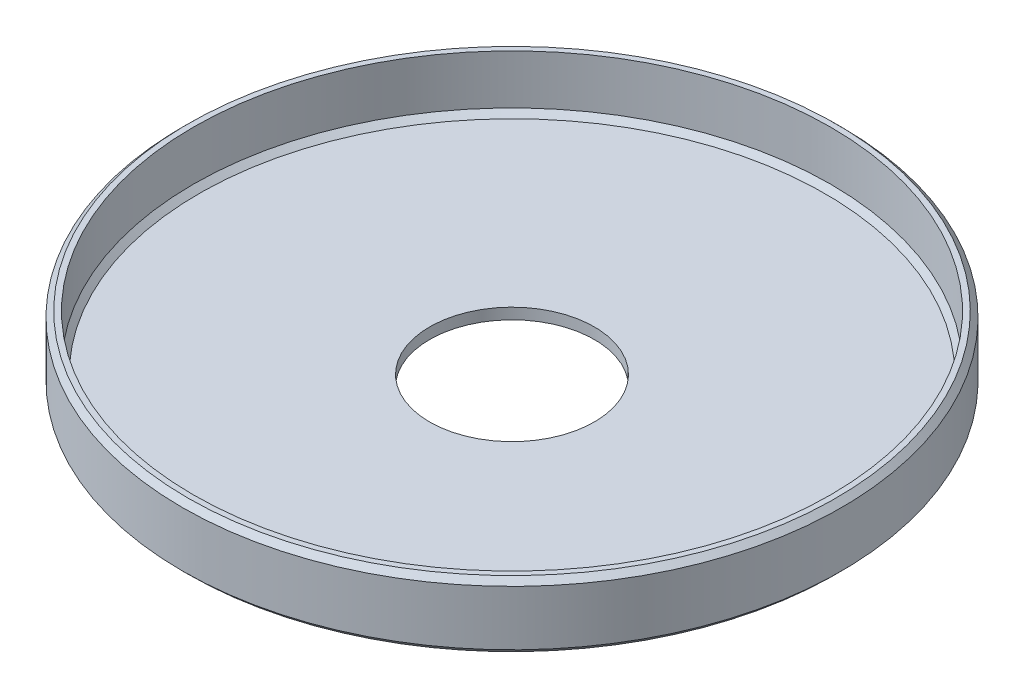
ISO-10303-21;
HEADER;
FILE_DESCRIPTION(('STEP AP214'),'2;1');
FILE_NAME('part.step','',(''),(''),'','','');
FILE_SCHEMA(('AUTOMOTIVE_DESIGN { 1 0 10303 214 1 1 1 1 }'));
ENDSEC;
DATA;
#1=APPLICATION_CONTEXT('core data for automotive mechanical design processes');
#2=APPLICATION_PROTOCOL_DEFINITION('international standard','automotive_design',2000,#1);
#3=PRODUCT_CONTEXT('',#1,'mechanical');
#4=PRODUCT('Part','Part','',(#3));
#5=PRODUCT_RELATED_PRODUCT_CATEGORY('part','',(#4));
#6=PRODUCT_DEFINITION_FORMATION('','',#4);
#7=PRODUCT_DEFINITION_CONTEXT('part definition',#1,'design');
#8=PRODUCT_DEFINITION('design','',#6,#7);
#9=PRODUCT_DEFINITION_SHAPE('','',#8);
#10=(LENGTH_UNIT() NAMED_UNIT(*) SI_UNIT(.MILLI.,.METRE.));
#11=(NAMED_UNIT(*) PLANE_ANGLE_UNIT() SI_UNIT($,.RADIAN.));
#12=(NAMED_UNIT(*) SI_UNIT($,.STERADIAN.) SOLID_ANGLE_UNIT());
#13=UNCERTAINTY_MEASURE_WITH_UNIT(LENGTH_MEASURE(1.E-05),#10,'distance_accuracy_value','');
#14=(GEOMETRIC_REPRESENTATION_CONTEXT(3) GLOBAL_UNCERTAINTY_ASSIGNED_CONTEXT((#13)) GLOBAL_UNIT_ASSIGNED_CONTEXT((#10,
#11,#12)) REPRESENTATION_CONTEXT('',''));
#15=CARTESIAN_POINT('',(0.,0.,0.));
#16=DIRECTION('',(0.,0.,1.));
#17=DIRECTION('',(1.,0.,0.));
#18=AXIS2_PLACEMENT_3D('',#15,#16,#17);
#19=CARTESIAN_POINT('',(0.,2.,0.));
#20=DIRECTION('',(0.,1.,0.));
#21=DIRECTION('',(0.,0.,1.));
#22=AXIS2_PLACEMENT_3D('',#19,#20,#21);
#23=PLANE('',#22);
#24=CARTESIAN_POINT('',(0.,2.,0.));
#25=DIRECTION('',(0.,1.,0.));
#26=DIRECTION('',(0.,0.,1.));
#27=AXIS2_PLACEMENT_3D('',#24,#25,#26);
#28=CIRCLE('',#27,57.);
#29=CARTESIAN_POINT('',(0.,2.,57.));
#30=VERTEX_POINT('',#29);
#31=EDGE_CURVE('E56',#30,#30,#28,.T.);
#32=ORIENTED_EDGE('',*,*,#31,.T.);
#33=EDGE_LOOP('',(#32));
#34=FACE_BOUND('',#33,.T.);
#35=CARTESIAN_POINT('',(0.,2.,0.));
#36=DIRECTION('',(0.,1.,0.));
#37=DIRECTION('',(0.,0.,1.));
#38=AXIS2_PLACEMENT_3D('',#35,#36,#37);
#39=CIRCLE('',#38,15.);
#40=CARTESIAN_POINT('',(0.,2.,15.));
#41=VERTEX_POINT('',#40);
#42=EDGE_CURVE('E62',#41,#41,#39,.T.);
#43=ORIENTED_EDGE('',*,*,#42,.F.);
#44=EDGE_LOOP('',(#43));
#45=FACE_BOUND('',#44,.T.);
#46=ADVANCED_FACE('F35',(#34,#45),#23,.T.);
#47=CARTESIAN_POINT('',(0.,0.,0.));
#48=DIRECTION('',(0.,1.,0.));
#49=DIRECTION('',(0.,0.,1.));
#50=AXIS2_PLACEMENT_3D('',#47,#48,#49);
#51=PLANE('',#50);
#52=CARTESIAN_POINT('',(0.,0.,0.));
#53=DIRECTION('',(0.,1.,0.));
#54=DIRECTION('',(0.,0.,1.));
#55=AXIS2_PLACEMENT_3D('',#52,#53,#54);
#56=CIRCLE('',#55,59.);
#57=CARTESIAN_POINT('',(0.,0.,59.));
#58=VERTEX_POINT('',#57);
#59=EDGE_CURVE('E47',#58,#58,#56,.F.);
#60=ORIENTED_EDGE('',*,*,#59,.T.);
#61=EDGE_LOOP('',(#60));
#62=FACE_BOUND('',#61,.T.);
#63=CARTESIAN_POINT('',(0.,0.,0.));
#64=DIRECTION('',(0.,1.,0.));
#65=DIRECTION('',(0.,0.,1.));
#66=AXIS2_PLACEMENT_3D('',#63,#64,#65);
#67=CIRCLE('',#66,15.);
#68=CARTESIAN_POINT('',(0.,0.,15.));
#69=VERTEX_POINT('',#68);
#70=EDGE_CURVE('E63',#69,#69,#67,.T.);
#71=ORIENTED_EDGE('',*,*,#70,.T.);
#72=EDGE_LOOP('',(#71));
#73=FACE_BOUND('',#72,.T.);
#74=ADVANCED_FACE('F89',(#62,#73),#51,.F.);
#75=CARTESIAN_POINT('',(0.,2.,0.));
#76=DIRECTION('',(0.,-1.,0.));
#77=DIRECTION('',(0.,0.,-1.));
#78=AXIS2_PLACEMENT_3D('',#75,#76,#77);
#79=CYLINDRICAL_SURFACE('',#78,60.);
#80=CARTESIAN_POINT('',(0.,11.,0.));
#81=DIRECTION('',(0.,1.,0.));
#82=DIRECTION('',(0.,0.,1.));
#83=AXIS2_PLACEMENT_3D('',#80,#81,#82);
#84=CIRCLE('',#83,60.);
#85=CARTESIAN_POINT('',(0.,11.,60.));
#86=VERTEX_POINT('',#85);
#87=EDGE_CURVE('E10',#86,#86,#84,.F.);
#88=ORIENTED_EDGE('',*,*,#87,.T.);
#89=EDGE_LOOP('',(#88));
#90=FACE_BOUND('',#89,.T.);
#91=CARTESIAN_POINT('',(0.,0.999999999999994,0.));
#92=DIRECTION('',(0.,1.,0.));
#93=DIRECTION('',(0.,0.,1.));
#94=AXIS2_PLACEMENT_3D('',#91,#92,#93);
#95=CIRCLE('',#94,60.);
#96=CARTESIAN_POINT('',(0.,0.999999999999994,60.));
#97=VERTEX_POINT('',#96);
#98=EDGE_CURVE('E51',#97,#97,#95,.T.);
#99=ORIENTED_EDGE('',*,*,#98,.T.);
#100=EDGE_LOOP('',(#99));
#101=FACE_BOUND('',#100,.T.);
#102=ADVANCED_FACE('F85',(#90,#101),#79,.T.);
#103=CARTESIAN_POINT('',(0.,2.,0.));
#104=DIRECTION('',(0.,-1.,0.));
#105=DIRECTION('',(0.,0.,-1.));
#106=AXIS2_PLACEMENT_3D('',#103,#104,#105);
#107=CYLINDRICAL_SURFACE('',#106,15.);
#108=ORIENTED_EDGE('',*,*,#42,.T.);
#109=EDGE_LOOP('',(#108));
#110=FACE_BOUND('',#109,.T.);
#111=ORIENTED_EDGE('',*,*,#70,.F.);
#112=EDGE_LOOP('',(#111));
#113=FACE_BOUND('',#112,.T.);
#114=ADVANCED_FACE('F76',(#110,#113),#107,.F.);
#115=CARTESIAN_POINT('',(0.,12.,0.));
#116=DIRECTION('',(0.,1.,0.));
#117=DIRECTION('',(0.,0.,1.));
#118=AXIS2_PLACEMENT_3D('',#115,#116,#117);
#119=PLANE('',#118);
#120=CARTESIAN_POINT('',(0.,12.,0.));
#121=DIRECTION('',(0.,1.,0.));
#122=DIRECTION('',(0.,0.,1.));
#123=AXIS2_PLACEMENT_3D('',#120,#121,#122);
#124=CIRCLE('',#123,59.);
#125=CARTESIAN_POINT('',(0.,12.,59.));
#126=VERTEX_POINT('',#125);
#127=EDGE_CURVE('E43',#126,#126,#124,.T.);
#128=ORIENTED_EDGE('',*,*,#127,.T.);
#129=EDGE_LOOP('',(#128));
#130=FACE_BOUND('',#129,.T.);
#131=CARTESIAN_POINT('',(0.,12.,0.));
#132=DIRECTION('',(0.,1.,0.));
#133=DIRECTION('',(0.,0.,1.));
#134=AXIS2_PLACEMENT_3D('',#131,#132,#133);
#135=CIRCLE('',#134,58.);
#136=CARTESIAN_POINT('',(0.,12.,58.));
#137=VERTEX_POINT('',#136);
#138=EDGE_CURVE('E66',#137,#137,#135,.T.);
#139=ORIENTED_EDGE('',*,*,#138,.F.);
#140=EDGE_LOOP('',(#139));
#141=FACE_BOUND('',#140,.T.);
#142=ADVANCED_FACE('F74',(#130,#141),#119,.T.);
#143=CARTESIAN_POINT('',(0.,12.,0.));
#144=DIRECTION('',(0.,-1.,0.));
#145=DIRECTION('',(0.,0.,-1.));
#146=AXIS2_PLACEMENT_3D('',#143,#144,#145);
#147=CYLINDRICAL_SURFACE('',#146,58.);
#148=CARTESIAN_POINT('',(0.,2.99999999999999,0.));
#149=DIRECTION('',(0.,1.,0.));
#150=DIRECTION('',(0.,0.,1.));
#151=AXIS2_PLACEMENT_3D('',#148,#149,#150);
#152=CIRCLE('',#151,58.);
#153=CARTESIAN_POINT('',(0.,2.99999999999999,58.));
#154=VERTEX_POINT('',#153);
#155=EDGE_CURVE('E59',#154,#154,#152,.F.);
#156=ORIENTED_EDGE('',*,*,#155,.T.);
#157=EDGE_LOOP('',(#156));
#158=FACE_BOUND('',#157,.T.);
#159=ORIENTED_EDGE('',*,*,#138,.T.);
#160=EDGE_LOOP('',(#159));
#161=FACE_BOUND('',#160,.T.);
#162=ADVANCED_FACE('F72',(#158,#161),#147,.F.);
#163=CARTESIAN_POINT('',(0.,2.99999999999999,0.));
#164=DIRECTION('',(0.,1.,0.));
#165=DIRECTION('',(0.,0.,1.));
#166=AXIS2_PLACEMENT_3D('',#163,#164,#165);
#167=CONICAL_SURFACE('',#166,58.,0.785398163397448);
#168=ORIENTED_EDGE('',*,*,#31,.F.);
#169=EDGE_LOOP('',(#168));
#170=FACE_BOUND('',#169,.T.);
#171=ORIENTED_EDGE('',*,*,#155,.F.);
#172=EDGE_LOOP('',(#171));
#173=FACE_BOUND('',#172,.T.);
#174=ADVANCED_FACE('F82',(#170,#173),#167,.F.);
#175=CARTESIAN_POINT('',(0.,0.999999999999994,0.));
#176=DIRECTION('',(0.,1.,0.));
#177=DIRECTION('',(0.,0.,1.));
#178=AXIS2_PLACEMENT_3D('',#175,#176,#177);
#179=CONICAL_SURFACE('',#178,60.,0.785398163397452);
#180=ORIENTED_EDGE('',*,*,#59,.F.);
#181=EDGE_LOOP('',(#180));
#182=FACE_BOUND('',#181,.T.);
#183=ORIENTED_EDGE('',*,*,#98,.F.);
#184=EDGE_LOOP('',(#183));
#185=FACE_BOUND('',#184,.T.);
#186=ADVANCED_FACE('F106',(#182,#185),#179,.T.);
#187=CARTESIAN_POINT('',(0.,12.,0.));
#188=DIRECTION('',(0.,-1.,0.));
#189=DIRECTION('',(0.,0.,-1.));
#190=AXIS2_PLACEMENT_3D('',#187,#188,#189);
#191=CONICAL_SURFACE('',#190,59.,0.785398163397452);
#192=ORIENTED_EDGE('',*,*,#87,.F.);
#193=EDGE_LOOP('',(#192));
#194=FACE_BOUND('',#193,.T.);
#195=ORIENTED_EDGE('',*,*,#127,.F.);
#196=EDGE_LOOP('',(#195));
#197=FACE_BOUND('',#196,.T.);
#198=ADVANCED_FACE('F38',(#194,#197),#191,.T.);
#199=CLOSED_SHELL('',(#46,#74,#102,#114,#142,#162,#174,#186,#198));
#200=MANIFOLD_SOLID_BREP('B2',#199);
#201=ADVANCED_BREP_SHAPE_REPRESENTATION('',(#18,#200),#14);
#202=SHAPE_DEFINITION_REPRESENTATION(#9,#201);
ENDSEC;
END-ISO-10303-21;
